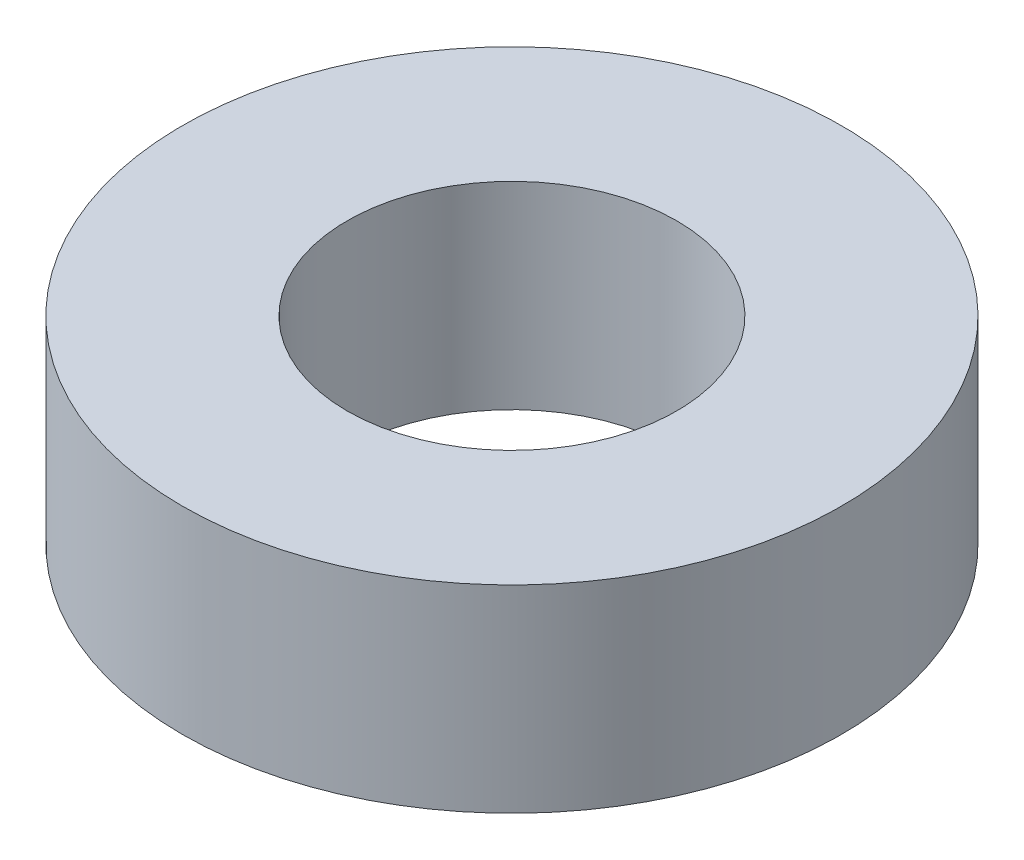
ISO-10303-21;
HEADER;
FILE_DESCRIPTION(('STEP AP214'),'2;1');
FILE_NAME('part.step','',(''),(''),'','','');
FILE_SCHEMA(('AUTOMOTIVE_DESIGN { 1 0 10303 214 1 1 1 1 }'));
ENDSEC;
DATA;
#1=APPLICATION_CONTEXT('core data for automotive mechanical design processes');
#2=APPLICATION_PROTOCOL_DEFINITION('international standard','automotive_design',2000,#1);
#3=PRODUCT_CONTEXT('',#1,'mechanical');
#4=PRODUCT('Part','Part','',(#3));
#5=PRODUCT_RELATED_PRODUCT_CATEGORY('part','',(#4));
#6=PRODUCT_DEFINITION_FORMATION('','',#4);
#7=PRODUCT_DEFINITION_CONTEXT('part definition',#1,'design');
#8=PRODUCT_DEFINITION('design','',#6,#7);
#9=PRODUCT_DEFINITION_SHAPE('','',#8);
#10=(LENGTH_UNIT() NAMED_UNIT(*) SI_UNIT(.MILLI.,.METRE.));
#11=(NAMED_UNIT(*) PLANE_ANGLE_UNIT() SI_UNIT($,.RADIAN.));
#12=(NAMED_UNIT(*) SI_UNIT($,.STERADIAN.) SOLID_ANGLE_UNIT());
#13=UNCERTAINTY_MEASURE_WITH_UNIT(LENGTH_MEASURE(1.E-05),#10,'distance_accuracy_value','');
#14=(GEOMETRIC_REPRESENTATION_CONTEXT(3) GLOBAL_UNCERTAINTY_ASSIGNED_CONTEXT((#13)) GLOBAL_UNIT_ASSIGNED_CONTEXT((#10,
#11,#12)) REPRESENTATION_CONTEXT('',''));
#15=CARTESIAN_POINT('',(0.,0.,0.));
#16=DIRECTION('',(0.,0.,1.));
#17=DIRECTION('',(1.,0.,0.));
#18=AXIS2_PLACEMENT_3D('',#15,#16,#17);
#19=CARTESIAN_POINT('',(0.,6.,0.));
#20=DIRECTION('',(0.,1.,0.));
#21=DIRECTION('',(0.,0.,1.));
#22=AXIS2_PLACEMENT_3D('',#19,#20,#21);
#23=PLANE('',#22);
#24=CARTESIAN_POINT('',(0.,6.,0.));
#25=DIRECTION('',(0.,1.,0.));
#26=DIRECTION('',(0.,0.,1.));
#27=AXIS2_PLACEMENT_3D('',#24,#25,#26);
#28=CIRCLE('',#27,10.);
#29=CARTESIAN_POINT('',(0.,6.,10.));
#30=VERTEX_POINT('',#29);
#31=EDGE_CURVE('E11',#30,#30,#28,.T.);
#32=ORIENTED_EDGE('',*,*,#31,.T.);
#33=EDGE_LOOP('',(#32));
#34=FACE_BOUND('',#33,.T.);
#35=CARTESIAN_POINT('',(0.,6.,0.));
#36=DIRECTION('',(0.,1.,0.));
#37=DIRECTION('',(0.,0.,1.));
#38=AXIS2_PLACEMENT_3D('',#35,#36,#37);
#39=CIRCLE('',#38,5.);
#40=CARTESIAN_POINT('',(0.,6.,5.));
#41=VERTEX_POINT('',#40);
#42=EDGE_CURVE('E52',#41,#41,#39,.T.);
#43=ORIENTED_EDGE('',*,*,#42,.F.);
#44=EDGE_LOOP('',(#43));
#45=FACE_BOUND('',#44,.T.);
#46=ADVANCED_FACE('F41',(#34,#45),#23,.T.);
#47=CARTESIAN_POINT('',(0.,0.,0.));
#48=DIRECTION('',(0.,1.,0.));
#49=DIRECTION('',(0.,0.,1.));
#50=AXIS2_PLACEMENT_3D('',#47,#48,#49);
#51=PLANE('',#50);
#52=CARTESIAN_POINT('',(0.,0.,0.));
#53=DIRECTION('',(0.,1.,0.));
#54=DIRECTION('',(0.,0.,1.));
#55=AXIS2_PLACEMENT_3D('',#52,#53,#54);
#56=CIRCLE('',#55,10.);
#57=CARTESIAN_POINT('',(0.,0.,10.));
#58=VERTEX_POINT('',#57);
#59=EDGE_CURVE('E45',#58,#58,#56,.T.);
#60=ORIENTED_EDGE('',*,*,#59,.F.);
#61=EDGE_LOOP('',(#60));
#62=FACE_BOUND('',#61,.T.);
#63=CARTESIAN_POINT('',(0.,0.,0.));
#64=DIRECTION('',(0.,1.,0.));
#65=DIRECTION('',(0.,0.,1.));
#66=AXIS2_PLACEMENT_3D('',#63,#64,#65);
#67=CIRCLE('',#66,5.);
#68=CARTESIAN_POINT('',(0.,0.,5.));
#69=VERTEX_POINT('',#68);
#70=EDGE_CURVE('E54',#69,#69,#67,.T.);
#71=ORIENTED_EDGE('',*,*,#70,.T.);
#72=EDGE_LOOP('',(#71));
#73=FACE_BOUND('',#72,.T.);
#74=ADVANCED_FACE('F64',(#62,#73),#51,.F.);
#75=CARTESIAN_POINT('',(0.,6.,0.));
#76=DIRECTION('',(0.,-1.,0.));
#77=DIRECTION('',(0.,0.,-1.));
#78=AXIS2_PLACEMENT_3D('',#75,#76,#77);
#79=CYLINDRICAL_SURFACE('',#78,10.);
#80=ORIENTED_EDGE('',*,*,#31,.F.);
#81=EDGE_LOOP('',(#80));
#82=FACE_BOUND('',#81,.T.);
#83=ORIENTED_EDGE('',*,*,#59,.T.);
#84=EDGE_LOOP('',(#83));
#85=FACE_BOUND('',#84,.T.);
#86=ADVANCED_FACE('F43',(#82,#85),#79,.T.);
#87=CARTESIAN_POINT('',(0.,6.,0.));
#88=DIRECTION('',(0.,-1.,0.));
#89=DIRECTION('',(0.,0.,-1.));
#90=AXIS2_PLACEMENT_3D('',#87,#88,#89);
#91=CYLINDRICAL_SURFACE('',#90,5.);
#92=ORIENTED_EDGE('',*,*,#42,.T.);
#93=EDGE_LOOP('',(#92));
#94=FACE_BOUND('',#93,.T.);
#95=ORIENTED_EDGE('',*,*,#70,.F.);
#96=EDGE_LOOP('',(#95));
#97=FACE_BOUND('',#96,.T.);
#98=ADVANCED_FACE('F60',(#94,#97),#91,.F.);
#99=CLOSED_SHELL('',(#46,#74,#86,#98));
#100=MANIFOLD_SOLID_BREP('B2',#99);
#101=ADVANCED_BREP_SHAPE_REPRESENTATION('',(#18,#100),#14);
#102=SHAPE_DEFINITION_REPRESENTATION(#9,#101);
ENDSEC;
END-ISO-10303-21;
